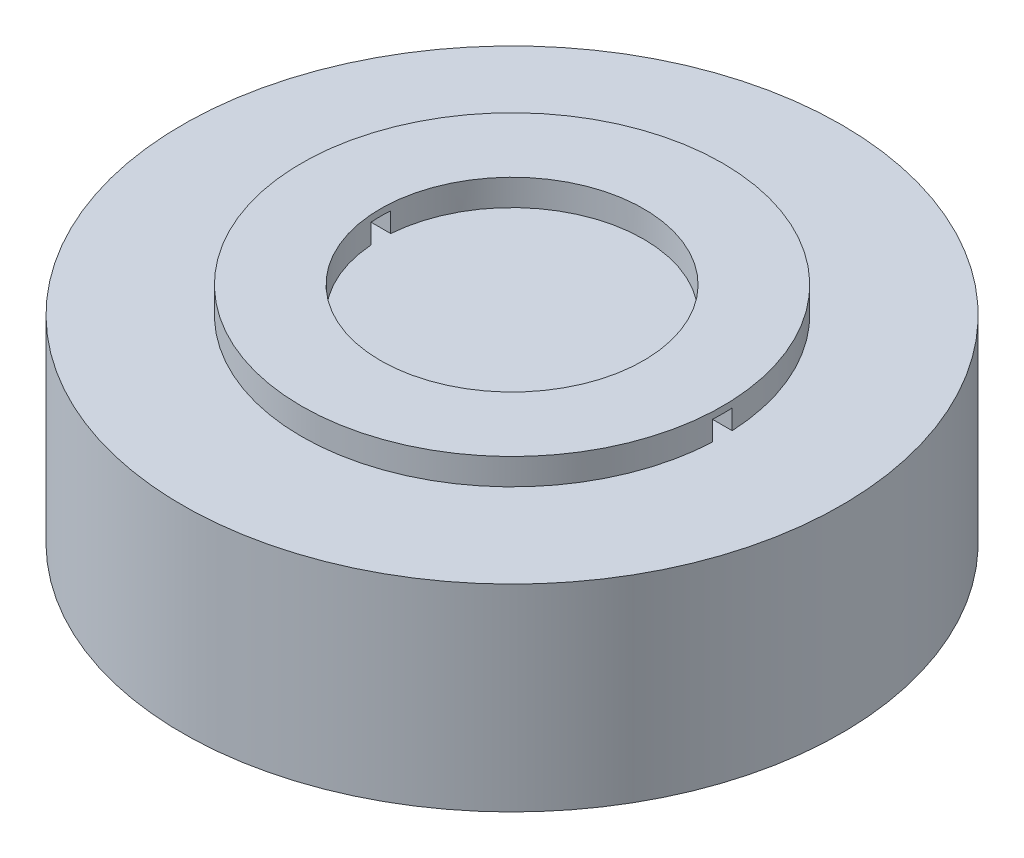
ISO-10303-21;
HEADER;
FILE_DESCRIPTION(('STEP AP214'),'2;1');
FILE_NAME('part.step','',(''),(''),'','','');
FILE_SCHEMA(('AUTOMOTIVE_DESIGN { 1 0 10303 214 1 1 1 1 }'));
ENDSEC;
DATA;
#1=APPLICATION_CONTEXT('core data for automotive mechanical design processes');
#2=APPLICATION_PROTOCOL_DEFINITION('international standard','automotive_design',2000,#1);
#3=PRODUCT_CONTEXT('',#1,'mechanical');
#4=PRODUCT('Part','Part','',(#3));
#5=PRODUCT_RELATED_PRODUCT_CATEGORY('part','',(#4));
#6=PRODUCT_DEFINITION_FORMATION('','',#4);
#7=PRODUCT_DEFINITION_CONTEXT('part definition',#1,'design');
#8=PRODUCT_DEFINITION('design','',#6,#7);
#9=PRODUCT_DEFINITION_SHAPE('','',#8);
#10=(LENGTH_UNIT() NAMED_UNIT(*) SI_UNIT(.MILLI.,.METRE.));
#11=(NAMED_UNIT(*) PLANE_ANGLE_UNIT() SI_UNIT($,.RADIAN.));
#12=(NAMED_UNIT(*) SI_UNIT($,.STERADIAN.) SOLID_ANGLE_UNIT());
#13=UNCERTAINTY_MEASURE_WITH_UNIT(LENGTH_MEASURE(1.E-05),#10,'distance_accuracy_value','');
#14=(GEOMETRIC_REPRESENTATION_CONTEXT(3) GLOBAL_UNCERTAINTY_ASSIGNED_CONTEXT((#13)) GLOBAL_UNIT_ASSIGNED_CONTEXT((#10,
#11,#12)) REPRESENTATION_CONTEXT('',''));
#15=CARTESIAN_POINT('',(0.,0.,0.));
#16=DIRECTION('',(0.,0.,1.));
#17=DIRECTION('',(1.,0.,0.));
#18=AXIS2_PLACEMENT_3D('',#15,#16,#17);
#19=CARTESIAN_POINT('',(-30.,-0.5,-0.75));
#20=DIRECTION('',(0.,0.,1.));
#21=DIRECTION('',(1.,0.,0.));
#22=AXIS2_PLACEMENT_3D('',#19,#20,#21);
#23=PLANE('',#22);
#24=DIRECTION('',(0.,1.,0.));
#25=VECTOR('',#24,1.);
#26=CARTESIAN_POINT('',(9.97183533758957,-2.,-0.75));
#27=LINE('',#26,#25);
#28=CARTESIAN_POINT('',(9.97183533758957,-2.,-0.75));
#29=VERTEX_POINT('',#28);
#30=CARTESIAN_POINT('',(9.97183533758957,-0.5,-0.75));
#31=VERTEX_POINT('',#30);
#32=EDGE_CURVE('E114',#29,#31,#27,.T.);
#33=ORIENTED_EDGE('',*,*,#32,.F.);
#34=DIRECTION('',(-1.,0.,0.));
#35=VECTOR('',#34,1.);
#36=CARTESIAN_POINT('',(-30.,-2.,-0.75));
#37=LINE('',#36,#35);
#38=CARTESIAN_POINT('',(15.9824122084246,-2.,-0.75));
#39=VERTEX_POINT('',#38);
#40=EDGE_CURVE('E133',#39,#29,#37,.T.);
#41=ORIENTED_EDGE('',*,*,#40,.F.);
#42=DIRECTION('',(0.,1.,0.));
#43=VECTOR('',#42,1.);
#44=CARTESIAN_POINT('',(15.9824122084246,-2.,-0.75));
#45=LINE('',#44,#43);
#46=CARTESIAN_POINT('',(15.9824122084246,-0.5,-0.75));
#47=VERTEX_POINT('',#46);
#48=EDGE_CURVE('E153',#47,#39,#45,.F.);
#49=ORIENTED_EDGE('',*,*,#48,.F.);
#50=DIRECTION('',(-1.,0.,0.));
#51=VECTOR('',#50,1.);
#52=CARTESIAN_POINT('',(-30.,-0.5,-0.75));
#53=LINE('',#52,#51);
#54=EDGE_CURVE('E202',#47,#31,#53,.T.);
#55=ORIENTED_EDGE('',*,*,#54,.T.);
#56=EDGE_LOOP('',(#33,#41,#49,#55));
#57=FACE_BOUND('',#56,.T.);
#58=ADVANCED_FACE('F39',(#57),#23,.T.);
#59=CARTESIAN_POINT('',(-30.,-0.5,0.75));
#60=DIRECTION('',(0.,0.,-1.));
#61=DIRECTION('',(-1.,0.,0.));
#62=AXIS2_PLACEMENT_3D('',#59,#60,#61);
#63=PLANE('',#62);
#64=DIRECTION('',(0.,1.,0.));
#65=VECTOR('',#64,1.);
#66=CARTESIAN_POINT('',(-9.97183533758957,-2.,0.75));
#67=LINE('',#66,#65);
#68=CARTESIAN_POINT('',(-9.97183533758957,-2.,0.75));
#69=VERTEX_POINT('',#68);
#70=CARTESIAN_POINT('',(-9.97183533758957,-0.5,0.75));
#71=VERTEX_POINT('',#70);
#72=EDGE_CURVE('E55',#69,#71,#67,.T.);
#73=ORIENTED_EDGE('',*,*,#72,.F.);
#74=DIRECTION('',(1.,0.,0.));
#75=VECTOR('',#74,1.);
#76=CARTESIAN_POINT('',(-30.,-2.,0.75));
#77=LINE('',#76,#75);
#78=CARTESIAN_POINT('',(-15.9824122084246,-2.,0.75));
#79=VERTEX_POINT('',#78);
#80=EDGE_CURVE('E123',#79,#69,#77,.T.);
#81=ORIENTED_EDGE('',*,*,#80,.F.);
#82=DIRECTION('',(0.,1.,0.));
#83=VECTOR('',#82,1.);
#84=CARTESIAN_POINT('',(-15.9824122084246,-2.,0.75));
#85=LINE('',#84,#83);
#86=CARTESIAN_POINT('',(-15.9824122084246,-0.5,0.75));
#87=VERTEX_POINT('',#86);
#88=EDGE_CURVE('E144',#87,#79,#85,.F.);
#89=ORIENTED_EDGE('',*,*,#88,.F.);
#90=DIRECTION('',(1.,0.,0.));
#91=VECTOR('',#90,1.);
#92=CARTESIAN_POINT('',(-30.,-0.5,0.75));
#93=LINE('',#92,#91);
#94=EDGE_CURVE('E145',#87,#71,#93,.T.);
#95=ORIENTED_EDGE('',*,*,#94,.T.);
#96=EDGE_LOOP('',(#73,#81,#89,#95));
#97=FACE_BOUND('',#96,.T.);
#98=ADVANCED_FACE('F198',(#97),#63,.T.);
#99=CARTESIAN_POINT('',(0.,-0.5,0.));
#100=DIRECTION('',(0.,1.,0.));
#101=DIRECTION('',(0.,0.,1.));
#102=AXIS2_PLACEMENT_3D('',#99,#100,#101);
#103=PLANE('',#102);
#104=CARTESIAN_POINT('',(9.97183533758957,-0.5,0.75));
#105=VERTEX_POINT('',#104);
#106=CARTESIAN_POINT('',(15.9824122084246,-0.5,0.75));
#107=VERTEX_POINT('',#106);
#108=EDGE_CURVE('E200',#105,#107,#93,.T.);
#109=ORIENTED_EDGE('',*,*,#108,.F.);
#110=CARTESIAN_POINT('',(0.,-0.5,0.));
#111=DIRECTION('',(0.,1.,0.));
#112=DIRECTION('',(0.,0.,1.));
#113=AXIS2_PLACEMENT_3D('',#110,#111,#112);
#114=CIRCLE('',#113,10.);
#115=EDGE_CURVE('E11',#105,#31,#114,.T.);
#116=ORIENTED_EDGE('',*,*,#115,.T.);
#117=ORIENTED_EDGE('',*,*,#54,.F.);
#118=CARTESIAN_POINT('',(0.,-0.5,0.));
#119=DIRECTION('',(0.,1.,0.));
#120=DIRECTION('',(0.,0.,1.));
#121=AXIS2_PLACEMENT_3D('',#118,#119,#120);
#122=CIRCLE('',#121,16.);
#123=EDGE_CURVE('E180',#47,#107,#122,.F.);
#124=ORIENTED_EDGE('',*,*,#123,.T.);
#125=EDGE_LOOP('',(#109,#116,#117,#124));
#126=FACE_BOUND('',#125,.T.);
#127=ADVANCED_FACE('F225',(#126),#103,.F.);
#128=CARTESIAN_POINT('',(0.,-2.,0.));
#129=DIRECTION('',(0.,1.,0.));
#130=DIRECTION('',(0.,0.,1.));
#131=AXIS2_PLACEMENT_3D('',#128,#129,#130);
#132=CYLINDRICAL_SURFACE('',#131,16.);
#133=CARTESIAN_POINT('',(0.,0.,0.));
#134=DIRECTION('',(0.,1.,0.));
#135=DIRECTION('',(0.,0.,1.));
#136=AXIS2_PLACEMENT_3D('',#133,#134,#135);
#137=CIRCLE('',#136,16.);
#138=CARTESIAN_POINT('',(0.,0.,16.));
#139=VERTEX_POINT('',#138);
#140=EDGE_CURVE('E177',#139,#139,#137,.T.);
#141=ORIENTED_EDGE('',*,*,#140,.F.);
#142=EDGE_LOOP('',(#141));
#143=FACE_BOUND('',#142,.T.);
#144=CARTESIAN_POINT('',(0.,-2.,0.));
#145=DIRECTION('',(0.,1.,0.));
#146=DIRECTION('',(0.,0.,1.));
#147=AXIS2_PLACEMENT_3D('',#144,#145,#146);
#148=CIRCLE('',#147,16.);
#149=CARTESIAN_POINT('',(-15.9824122084246,-2.,-0.75));
#150=VERTEX_POINT('',#149);
#151=EDGE_CURVE('E176',#39,#150,#148,.T.);
#152=ORIENTED_EDGE('',*,*,#151,.T.);
#153=DIRECTION('',(0.,1.,0.));
#154=VECTOR('',#153,1.);
#155=CARTESIAN_POINT('',(-15.9824122084246,-2.,-0.75));
#156=LINE('',#155,#154);
#157=CARTESIAN_POINT('',(-15.9824122084246,-0.5,-0.75));
#158=VERTEX_POINT('',#157);
#159=EDGE_CURVE('E149',#150,#158,#156,.T.);
#160=ORIENTED_EDGE('',*,*,#159,.T.);
#161=EDGE_CURVE('E183',#87,#158,#122,.F.);
#162=ORIENTED_EDGE('',*,*,#161,.F.);
#163=ORIENTED_EDGE('',*,*,#88,.T.);
#164=CARTESIAN_POINT('',(15.9824122084246,-2.,0.75));
#165=VERTEX_POINT('',#164);
#166=EDGE_CURVE('E170',#79,#165,#148,.T.);
#167=ORIENTED_EDGE('',*,*,#166,.T.);
#168=DIRECTION('',(0.,1.,0.));
#169=VECTOR('',#168,1.);
#170=CARTESIAN_POINT('',(15.9824122084246,-2.,0.75));
#171=LINE('',#170,#169);
#172=EDGE_CURVE('E130',#165,#107,#171,.T.);
#173=ORIENTED_EDGE('',*,*,#172,.T.);
#174=ORIENTED_EDGE('',*,*,#123,.F.);
#175=ORIENTED_EDGE('',*,*,#48,.T.);
#176=EDGE_LOOP('',(#152,#160,#162,#163,#167,#173,#174,#175));
#177=FACE_BOUND('',#176,.T.);
#178=ADVANCED_FACE('F41',(#143,#177),#132,.T.);
#179=CARTESIAN_POINT('',(0.,0.,0.));
#180=DIRECTION('',(0.,1.,0.));
#181=DIRECTION('',(0.,0.,1.));
#182=AXIS2_PLACEMENT_3D('',#179,#180,#181);
#183=PLANE('',#182);
#184=CARTESIAN_POINT('',(0.,0.,0.));
#185=DIRECTION('',(0.,1.,0.));
#186=DIRECTION('',(0.,0.,1.));
#187=AXIS2_PLACEMENT_3D('',#184,#185,#186);
#188=CIRCLE('',#187,10.);
#189=CARTESIAN_POINT('',(0.,0.,10.));
#190=VERTEX_POINT('',#189);
#191=EDGE_CURVE('E126',#190,#190,#188,.T.);
#192=ORIENTED_EDGE('',*,*,#191,.F.);
#193=EDGE_LOOP('',(#192));
#194=FACE_BOUND('',#193,.T.);
#195=ORIENTED_EDGE('',*,*,#140,.T.);
#196=EDGE_LOOP('',(#195));
#197=FACE_BOUND('',#196,.T.);
#198=ADVANCED_FACE('F217',(#194,#197),#183,.T.);
#199=CARTESIAN_POINT('',(0.,-17.,0.));
#200=DIRECTION('',(0.,1.,0.));
#201=DIRECTION('',(0.,0.,1.));
#202=AXIS2_PLACEMENT_3D('',#199,#200,#201);
#203=CYLINDRICAL_SURFACE('',#202,25.05);
#204=CARTESIAN_POINT('',(0.,-17.,0.));
#205=DIRECTION('',(0.,-1.,0.));
#206=DIRECTION('',(0.,0.,-1.));
#207=AXIS2_PLACEMENT_3D('',#204,#205,#206);
#208=CIRCLE('',#207,25.05);
#209=CARTESIAN_POINT('',(0.,-17.,-25.05));
#210=VERTEX_POINT('',#209);
#211=EDGE_CURVE('E166',#210,#210,#208,.T.);
#212=ORIENTED_EDGE('',*,*,#211,.F.);
#213=EDGE_LOOP('',(#212));
#214=FACE_BOUND('',#213,.T.);
#215=CARTESIAN_POINT('',(0.,-2.,0.));
#216=DIRECTION('',(0.,-1.,0.));
#217=DIRECTION('',(0.,0.,-1.));
#218=AXIS2_PLACEMENT_3D('',#215,#216,#217);
#219=CIRCLE('',#218,25.05);
#220=CARTESIAN_POINT('',(0.,-2.,-25.05));
#221=VERTEX_POINT('',#220);
#222=EDGE_CURVE('E162',#221,#221,#219,.T.);
#223=ORIENTED_EDGE('',*,*,#222,.T.);
#224=EDGE_LOOP('',(#223));
#225=FACE_BOUND('',#224,.T.);
#226=ADVANCED_FACE('F220',(#214,#225),#203,.T.);
#227=CARTESIAN_POINT('',(0.,-17.,0.));
#228=DIRECTION('',(0.,-1.,0.));
#229=DIRECTION('',(0.,0.,-1.));
#230=AXIS2_PLACEMENT_3D('',#227,#228,#229);
#231=PLANE('',#230);
#232=CARTESIAN_POINT('',(0.,-17.,0.));
#233=DIRECTION('',(0.,-1.,0.));
#234=DIRECTION('',(0.,0.,-1.));
#235=AXIS2_PLACEMENT_3D('',#232,#233,#234);
#236=CIRCLE('',#235,2.);
#237=CARTESIAN_POINT('',(0.,-17.,-2.));
#238=VERTEX_POINT('',#237);
#239=EDGE_CURVE('E157',#238,#238,#236,.T.);
#240=ORIENTED_EDGE('',*,*,#239,.F.);
#241=EDGE_LOOP('',(#240));
#242=FACE_BOUND('',#241,.T.);
#243=ORIENTED_EDGE('',*,*,#211,.T.);
#244=EDGE_LOOP('',(#243));
#245=FACE_BOUND('',#244,.T.);
#246=ADVANCED_FACE('F265',(#242,#245),#231,.T.);
#247=CARTESIAN_POINT('',(0.,-2.,0.));
#248=DIRECTION('',(0.,-1.,0.));
#249=DIRECTION('',(0.,0.,-1.));
#250=AXIS2_PLACEMENT_3D('',#247,#248,#249);
#251=PLANE('',#250);
#252=CARTESIAN_POINT('',(0.,-2.,0.));
#253=DIRECTION('',(0.,1.,0.));
#254=DIRECTION('',(0.,0.,1.));
#255=AXIS2_PLACEMENT_3D('',#252,#253,#254);
#256=CIRCLE('',#255,10.);
#257=CARTESIAN_POINT('',(9.97183533758957,-2.,0.75));
#258=VERTEX_POINT('',#257);
#259=EDGE_CURVE('E109',#69,#258,#256,.T.);
#260=ORIENTED_EDGE('',*,*,#259,.T.);
#261=EDGE_CURVE('E121',#258,#165,#77,.T.);
#262=ORIENTED_EDGE('',*,*,#261,.T.);
#263=ORIENTED_EDGE('',*,*,#166,.F.);
#264=ORIENTED_EDGE('',*,*,#80,.T.);
#265=EDGE_LOOP('',(#260,#262,#263,#264));
#266=FACE_BOUND('',#265,.T.);
#267=ORIENTED_EDGE('',*,*,#40,.T.);
#268=CARTESIAN_POINT('',(-9.97183533758957,-2.,-0.75));
#269=VERTEX_POINT('',#268);
#270=EDGE_CURVE('E125',#29,#269,#256,.T.);
#271=ORIENTED_EDGE('',*,*,#270,.T.);
#272=EDGE_CURVE('E63',#269,#150,#37,.T.);
#273=ORIENTED_EDGE('',*,*,#272,.T.);
#274=ORIENTED_EDGE('',*,*,#151,.F.);
#275=EDGE_LOOP('',(#267,#271,#273,#274));
#276=FACE_BOUND('',#275,.T.);
#277=ORIENTED_EDGE('',*,*,#222,.F.);
#278=EDGE_LOOP('',(#277));
#279=FACE_BOUND('',#278,.T.);
#280=ADVANCED_FACE('F119',(#266,#276,#279),#251,.F.);
#281=CARTESIAN_POINT('',(0.,-7.,0.));
#282=DIRECTION('',(0.,-1.,0.));
#283=DIRECTION('',(0.,0.,-1.));
#284=AXIS2_PLACEMENT_3D('',#281,#282,#283);
#285=CYLINDRICAL_SURFACE('',#284,2.);
#286=CARTESIAN_POINT('',(0.,-7.,0.));
#287=DIRECTION('',(0.,-1.,0.));
#288=DIRECTION('',(0.,0.,-1.));
#289=AXIS2_PLACEMENT_3D('',#286,#287,#288);
#290=CIRCLE('',#289,2.);
#291=CARTESIAN_POINT('',(0.,-7.,-2.));
#292=VERTEX_POINT('',#291);
#293=EDGE_CURVE('E158',#292,#292,#290,.T.);
#294=ORIENTED_EDGE('',*,*,#293,.F.);
#295=EDGE_LOOP('',(#294));
#296=FACE_BOUND('',#295,.T.);
#297=ORIENTED_EDGE('',*,*,#239,.T.);
#298=EDGE_LOOP('',(#297));
#299=FACE_BOUND('',#298,.T.);
#300=ADVANCED_FACE('F254',(#296,#299),#285,.F.);
#301=CARTESIAN_POINT('',(0.,-7.,0.));
#302=DIRECTION('',(0.,-1.,0.));
#303=DIRECTION('',(0.,0.,-1.));
#304=AXIS2_PLACEMENT_3D('',#301,#302,#303);
#305=PLANE('',#304);
#306=ORIENTED_EDGE('',*,*,#293,.T.);
#307=EDGE_LOOP('',(#306));
#308=FACE_BOUND('',#307,.T.);
#309=ADVANCED_FACE('F248',(#308),#305,.T.);
#310=DIRECTION('',(0.,1.,0.));
#311=VECTOR('',#310,1.);
#312=CARTESIAN_POINT('',(-9.97183533758957,-2.,-0.75));
#313=LINE('',#312,#311);
#314=CARTESIAN_POINT('',(-9.97183533758957,-0.5,-0.75));
#315=VERTEX_POINT('',#314);
#316=EDGE_CURVE('E115',#315,#269,#313,.F.);
#317=ORIENTED_EDGE('',*,*,#316,.F.);
#318=EDGE_CURVE('E137',#315,#158,#53,.T.);
#319=ORIENTED_EDGE('',*,*,#318,.T.);
#320=ORIENTED_EDGE('',*,*,#159,.F.);
#321=ORIENTED_EDGE('',*,*,#272,.F.);
#322=EDGE_LOOP('',(#317,#319,#320,#321));
#323=FACE_BOUND('',#322,.T.);
#324=ADVANCED_FACE('F242',(#323),#23,.T.);
#325=DIRECTION('',(0.,1.,0.));
#326=VECTOR('',#325,1.);
#327=CARTESIAN_POINT('',(9.97183533758957,-2.,0.75));
#328=LINE('',#327,#326);
#329=EDGE_CURVE('E105',#105,#258,#328,.F.);
#330=ORIENTED_EDGE('',*,*,#329,.F.);
#331=ORIENTED_EDGE('',*,*,#108,.T.);
#332=ORIENTED_EDGE('',*,*,#172,.F.);
#333=ORIENTED_EDGE('',*,*,#261,.F.);
#334=EDGE_LOOP('',(#330,#331,#332,#333));
#335=FACE_BOUND('',#334,.T.);
#336=ADVANCED_FACE('F128',(#335),#63,.T.);
#337=ORIENTED_EDGE('',*,*,#318,.F.);
#338=EDGE_CURVE('E43',#315,#71,#114,.T.);
#339=ORIENTED_EDGE('',*,*,#338,.T.);
#340=ORIENTED_EDGE('',*,*,#94,.F.);
#341=ORIENTED_EDGE('',*,*,#161,.T.);
#342=EDGE_LOOP('',(#337,#339,#340,#341));
#343=FACE_BOUND('',#342,.T.);
#344=ADVANCED_FACE('F195',(#343),#103,.F.);
#345=CARTESIAN_POINT('',(0.,-2.,0.));
#346=DIRECTION('',(0.,1.,0.));
#347=DIRECTION('',(0.,0.,1.));
#348=AXIS2_PLACEMENT_3D('',#345,#346,#347);
#349=CYLINDRICAL_SURFACE('',#348,10.);
#350=ORIENTED_EDGE('',*,*,#32,.T.);
#351=ORIENTED_EDGE('',*,*,#115,.F.);
#352=ORIENTED_EDGE('',*,*,#329,.T.);
#353=ORIENTED_EDGE('',*,*,#259,.F.);
#354=ORIENTED_EDGE('',*,*,#72,.T.);
#355=ORIENTED_EDGE('',*,*,#338,.F.);
#356=ORIENTED_EDGE('',*,*,#316,.T.);
#357=ORIENTED_EDGE('',*,*,#270,.F.);
#358=EDGE_LOOP('',(#350,#351,#352,#353,#354,#355,#356,#357));
#359=FACE_BOUND('',#358,.T.);
#360=ORIENTED_EDGE('',*,*,#191,.T.);
#361=EDGE_LOOP('',(#360));
#362=FACE_BOUND('',#361,.T.);
#363=ADVANCED_FACE('F107',(#359,#362),#349,.F.);
#364=CLOSED_SHELL('',(#58,#98,#127,#178,#198,#226,#246,#280,#300,#309,#324,#336,#344,#363));
#365=MANIFOLD_SOLID_BREP('B2',#364);
#366=ADVANCED_BREP_SHAPE_REPRESENTATION('',(#18,#365),#14);
#367=SHAPE_DEFINITION_REPRESENTATION(#9,#366);
ENDSEC;
END-ISO-10303-21;
